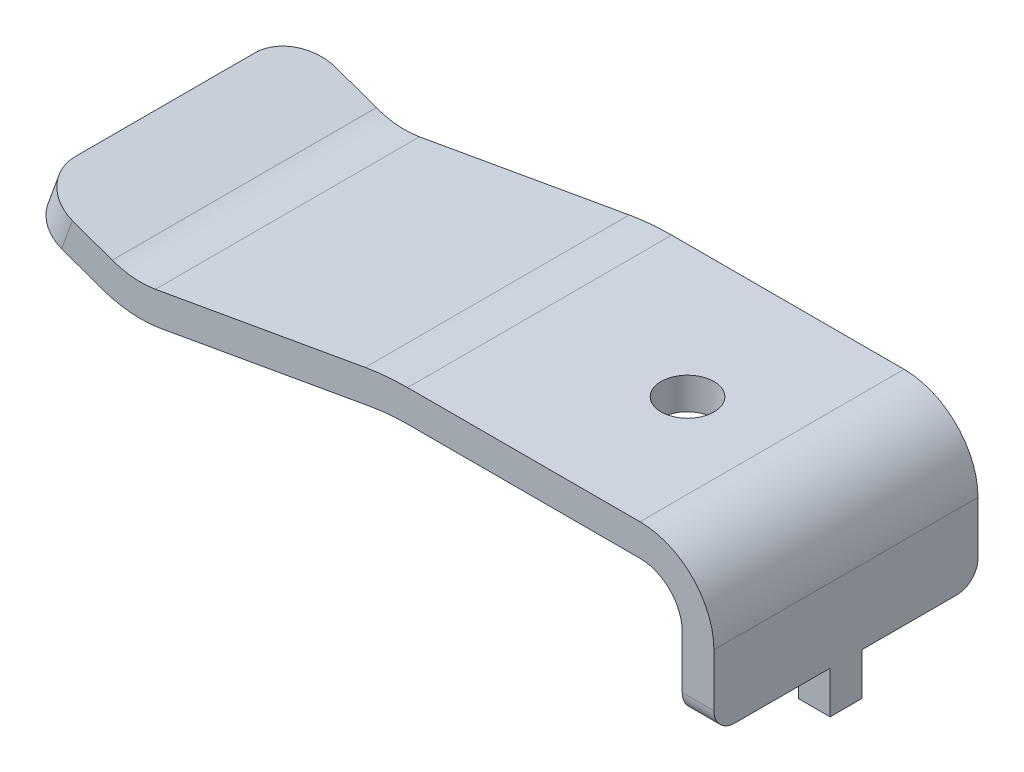
ISO-10303-21;
HEADER;
FILE_DESCRIPTION(('STEP AP214'),'2;1');
FILE_NAME('part.step','',(''),(''),'','','');
FILE_SCHEMA(('AUTOMOTIVE_DESIGN { 1 0 10303 214 1 1 1 1 }'));
ENDSEC;
DATA;
#1=APPLICATION_CONTEXT('core data for automotive mechanical design processes');
#2=APPLICATION_PROTOCOL_DEFINITION('international standard','automotive_design',2000,#1);
#3=PRODUCT_CONTEXT('',#1,'mechanical');
#4=PRODUCT('Part','Part','',(#3));
#5=PRODUCT_RELATED_PRODUCT_CATEGORY('part','',(#4));
#6=PRODUCT_DEFINITION_FORMATION('','',#4);
#7=PRODUCT_DEFINITION_CONTEXT('part definition',#1,'design');
#8=PRODUCT_DEFINITION('design','',#6,#7);
#9=PRODUCT_DEFINITION_SHAPE('','',#8);
#10=(LENGTH_UNIT() NAMED_UNIT(*) SI_UNIT(.MILLI.,.METRE.));
#11=(NAMED_UNIT(*) PLANE_ANGLE_UNIT() SI_UNIT($,.RADIAN.));
#12=(NAMED_UNIT(*) SI_UNIT($,.STERADIAN.) SOLID_ANGLE_UNIT());
#13=UNCERTAINTY_MEASURE_WITH_UNIT(LENGTH_MEASURE(1.E-05),#10,'distance_accuracy_value','');
#14=(GEOMETRIC_REPRESENTATION_CONTEXT(3) GLOBAL_UNCERTAINTY_ASSIGNED_CONTEXT((#13)) GLOBAL_UNIT_ASSIGNED_CONTEXT((#10,
#11,#12)) REPRESENTATION_CONTEXT('',''));
#15=CARTESIAN_POINT('',(0.,0.,0.));
#16=DIRECTION('',(0.,0.,1.));
#17=DIRECTION('',(1.,0.,0.));
#18=AXIS2_PLACEMENT_3D('',#15,#16,#17);
#19=CARTESIAN_POINT('',(-27.4903781497399,5.8216082742102,6.25));
#20=DIRECTION('',(-0.341026693224571,-0.94005361257128,0.));
#21=DIRECTION('',(0.94005361257128,-0.341026693224571,0.));
#22=AXIS2_PLACEMENT_3D('',#19,#20,#21);
#23=PLANE('',#22);
#24=DIRECTION('',(-0.94005361257128,0.341026693224571,0.));
#25=VECTOR('',#24,1.);
#26=CARTESIAN_POINT('',(-27.4955360364037,5.8234794196528,-6.25));
#27=LINE('',#26,#25);
#28=CARTESIAN_POINT('',(-27.4955360364037,5.8234794196528,-6.25));
#29=VERTEX_POINT('',#28);
#30=CARTESIAN_POINT('',(-29.3717153640693,6.50410786834311,-6.25));
#31=VERTEX_POINT('',#30);
#32=EDGE_CURVE('E160',#29,#31,#27,.T.);
#33=ORIENTED_EDGE('',*,*,#32,.F.);
#34=DIRECTION('',(0.,0.,-1.));
#35=VECTOR('',#34,1.);
#36=CARTESIAN_POINT('',(-27.4955360364037,5.8234794196528,6.25));
#37=LINE('',#36,#35);
#38=CARTESIAN_POINT('',(-27.4955360364037,5.8234794196528,6.25));
#39=VERTEX_POINT('',#38);
#40=EDGE_CURVE('E272',#39,#29,#37,.T.);
#41=ORIENTED_EDGE('',*,*,#40,.F.);
#42=DIRECTION('',(0.94005361257128,-0.341026693224571,0.));
#43=VECTOR('',#42,1.);
#44=CARTESIAN_POINT('',(-29.3717153640693,6.50410786834311,6.25));
#45=LINE('',#44,#43);
#46=CARTESIAN_POINT('',(-29.3717153640693,6.50410786834311,6.25));
#47=VERTEX_POINT('',#46);
#48=EDGE_CURVE('E184',#47,#39,#45,.T.);
#49=ORIENTED_EDGE('',*,*,#48,.F.);
#50=CARTESIAN_POINT('',(-29.3717153640693,6.50410786834311,4.25));
#51=DIRECTION('',(0.341026693224572,0.94005361257128,0.));
#52=DIRECTION('',(-0.94005361257128,0.341026693224572,0.));
#53=AXIS2_PLACEMENT_3D('',#50,#51,#52);
#54=CIRCLE('',#53,2.);
#55=CARTESIAN_POINT('',(-31.2518225892119,7.18616125479225,4.25));
#56=VERTEX_POINT('',#55);
#57=EDGE_CURVE('E186',#56,#47,#54,.T.);
#58=ORIENTED_EDGE('',*,*,#57,.F.);
#59=DIRECTION('',(0.,0.,1.));
#60=VECTOR('',#59,1.);
#61=CARTESIAN_POINT('',(-31.2518225892119,7.18616125479225,6.25));
#62=LINE('',#61,#60);
#63=CARTESIAN_POINT('',(-31.2518225892119,7.18616125479225,-4.25));
#64=VERTEX_POINT('',#63);
#65=EDGE_CURVE('E177',#64,#56,#62,.T.);
#66=ORIENTED_EDGE('',*,*,#65,.F.);
#67=CARTESIAN_POINT('',(-29.3717153640693,6.50410786834311,-4.25));
#68=DIRECTION('',(0.341026693224572,0.94005361257128,0.));
#69=DIRECTION('',(-0.94005361257128,0.341026693224572,0.));
#70=AXIS2_PLACEMENT_3D('',#67,#68,#69);
#71=CIRCLE('',#70,2.);
#72=EDGE_CURVE('E20',#31,#64,#71,.T.);
#73=ORIENTED_EDGE('',*,*,#72,.F.);
#74=EDGE_LOOP('',(#33,#41,#49,#58,#66,#73));
#75=FACE_BOUND('',#74,.T.);
#76=ADVANCED_FACE('F17',(#75),#23,.T.);
#77=CARTESIAN_POINT('',(-28.6089750620032,8.60663177822004,-4.25));
#78=DIRECTION('',(0.341026693224572,0.94005361257128,0.));
#79=DIRECTION('',(-0.94005361257128,0.341026693224572,0.));
#80=AXIS2_PLACEMENT_3D('',#77,#78,#79);
#81=CYLINDRICAL_SURFACE('',#80,2.);
#82=CARTESIAN_POINT('',(-28.8601753242325,7.91418828720003,-4.25));
#83=DIRECTION('',(0.341026693224572,0.94005361257128,0.));
#84=DIRECTION('',(-0.94005361257128,0.341026693224572,0.));
#85=AXIS2_PLACEMENT_3D('',#82,#83,#84);
#86=CIRCLE('',#85,2.);
#87=CARTESIAN_POINT('',(-30.740282549375,8.59624167364917,-4.25));
#88=VERTEX_POINT('',#87);
#89=CARTESIAN_POINT('',(-28.8601753242325,7.91418828720003,-6.25));
#90=VERTEX_POINT('',#89);
#91=EDGE_CURVE('E183',#88,#90,#86,.F.);
#92=ORIENTED_EDGE('',*,*,#91,.T.);
#93=DIRECTION('',(0.341026693224571,0.94005361257128,0.));
#94=VECTOR('',#93,1.);
#95=CARTESIAN_POINT('',(-29.3717153640693,6.50410786834311,-6.25));
#96=LINE('',#95,#94);
#97=EDGE_CURVE('E165',#31,#90,#96,.T.);
#98=ORIENTED_EDGE('',*,*,#97,.F.);
#99=ORIENTED_EDGE('',*,*,#72,.T.);
#100=DIRECTION('',(-0.341026693224572,-0.94005361257128,0.));
#101=VECTOR('',#100,1.);
#102=CARTESIAN_POINT('',(-31.2518225892119,7.18616125479225,-4.25));
#103=LINE('',#102,#101);
#104=EDGE_CURVE('E304',#88,#64,#103,.T.);
#105=ORIENTED_EDGE('',*,*,#104,.F.);
#106=EDGE_LOOP('',(#92,#98,#99,#105));
#107=FACE_BOUND('',#106,.T.);
#108=ADVANCED_FACE('F182',(#107),#81,.T.);
#109=CARTESIAN_POINT('',(-29.3717153640693,6.50410786834311,4.25));
#110=DIRECTION('',(0.341026693224572,0.94005361257128,0.));
#111=DIRECTION('',(-0.94005361257128,0.341026693224572,0.));
#112=AXIS2_PLACEMENT_3D('',#109,#110,#111);
#113=CYLINDRICAL_SURFACE('',#112,2.);
#114=CARTESIAN_POINT('',(-28.8601753242325,7.91418828720003,4.25));
#115=DIRECTION('',(0.341026693224572,0.94005361257128,0.));
#116=DIRECTION('',(-0.94005361257128,0.341026693224572,0.));
#117=AXIS2_PLACEMENT_3D('',#114,#115,#116);
#118=CIRCLE('',#117,2.);
#119=CARTESIAN_POINT('',(-28.8601753242325,7.91418828720003,6.25));
#120=VERTEX_POINT('',#119);
#121=CARTESIAN_POINT('',(-30.740282549375,8.59624167364917,4.25));
#122=VERTEX_POINT('',#121);
#123=EDGE_CURVE('E264',#120,#122,#118,.F.);
#124=ORIENTED_EDGE('',*,*,#123,.T.);
#125=DIRECTION('',(-0.341026693224572,-0.94005361257128,0.));
#126=VECTOR('',#125,1.);
#127=CARTESIAN_POINT('',(-31.2518225892119,7.18616125479225,4.25));
#128=LINE('',#127,#126);
#129=EDGE_CURVE('E192',#56,#122,#128,.F.);
#130=ORIENTED_EDGE('',*,*,#129,.F.);
#131=ORIENTED_EDGE('',*,*,#57,.T.);
#132=DIRECTION('',(0.341026693224572,0.94005361257128,0.));
#133=VECTOR('',#132,1.);
#134=CARTESIAN_POINT('',(-29.3717153640693,6.50410786834311,6.25));
#135=LINE('',#134,#133);
#136=EDGE_CURVE('E189',#47,#120,#135,.T.);
#137=ORIENTED_EDGE('',*,*,#136,.T.);
#138=EDGE_LOOP('',(#124,#130,#131,#137));
#139=FACE_BOUND('',#138,.T.);
#140=ADVANCED_FACE('F278',(#139),#113,.T.);
#141=CARTESIAN_POINT('',(-31.2518225892119,7.18616125479225,6.25));
#142=DIRECTION('',(-0.94005361257128,0.341026693224572,0.));
#143=DIRECTION('',(-0.341026693224572,-0.94005361257128,0.));
#144=AXIS2_PLACEMENT_3D('',#141,#142,#143);
#145=PLANE('',#144);
#146=DIRECTION('',(0.,0.,1.));
#147=VECTOR('',#146,1.);
#148=CARTESIAN_POINT('',(-30.740282549375,8.59624167364917,6.25));
#149=LINE('',#148,#147);
#150=EDGE_CURVE('E263',#122,#88,#149,.F.);
#151=ORIENTED_EDGE('',*,*,#150,.T.);
#152=ORIENTED_EDGE('',*,*,#104,.T.);
#153=ORIENTED_EDGE('',*,*,#65,.T.);
#154=ORIENTED_EDGE('',*,*,#129,.T.);
#155=EDGE_LOOP('',(#151,#152,#153,#154));
#156=FACE_BOUND('',#155,.T.);
#157=ADVANCED_FACE('F306',(#156),#145,.T.);
#158=CARTESIAN_POINT('',(-26.7327957343376,7.92600332952972,6.25));
#159=DIRECTION('',(0.,0.,-1.));
#160=DIRECTION('',(-1.,0.,0.));
#161=AXIS2_PLACEMENT_3D('',#158,#159,#160);
#162=CYLINDRICAL_SURFACE('',#161,2.2366);
#163=CARTESIAN_POINT('',(-26.7327957343376,7.92600332952972,6.25));
#164=DIRECTION('',(0.,0.,1.));
#165=DIRECTION('',(1.,0.,0.));
#166=AXIS2_PLACEMENT_3D('',#163,#164,#165);
#167=CIRCLE('',#166,2.2366);
#168=CARTESIAN_POINT('',(-27.4836700716117,5.81921257351642,6.25));
#169=VERTEX_POINT('',#168);
#170=EDGE_CURVE('E271',#39,#169,#167,.T.);
#171=ORIENTED_EDGE('',*,*,#170,.F.);
#172=ORIENTED_EDGE('',*,*,#40,.T.);
#173=CARTESIAN_POINT('',(-26.7327957343376,7.92600332952972,-6.25));
#174=DIRECTION('',(0.,0.,-1.));
#175=DIRECTION('',(-1.,0.,0.));
#176=AXIS2_PLACEMENT_3D('',#173,#174,#175);
#177=CIRCLE('',#176,2.2366);
#178=CARTESIAN_POINT('',(-27.4836700716117,5.81921257351642,-6.25));
#179=VERTEX_POINT('',#178);
#180=EDGE_CURVE('E169',#179,#29,#177,.T.);
#181=ORIENTED_EDGE('',*,*,#180,.F.);
#182=DIRECTION('',(0.,0.,-1.));
#183=VECTOR('',#182,1.);
#184=CARTESIAN_POINT('',(-27.4836700716117,5.81921257351642,6.25));
#185=LINE('',#184,#183);
#186=EDGE_CURVE('E261',#169,#179,#185,.T.);
#187=ORIENTED_EDGE('',*,*,#186,.F.);
#188=EDGE_LOOP('',(#171,#172,#181,#187));
#189=FACE_BOUND('',#188,.T.);
#190=ADVANCED_FACE('F312',(#189),#162,.T.);
#191=CARTESIAN_POINT('',(-26.9788381099031,7.23168869306712,6.25));
#192=DIRECTION('',(-0.341026693224571,-0.94005361257128,0.));
#193=DIRECTION('',(0.94005361257128,-0.341026693224571,0.));
#194=AXIS2_PLACEMENT_3D('',#191,#192,#193);
#195=PLANE('',#194);
#196=ORIENTED_EDGE('',*,*,#123,.F.);
#197=DIRECTION('',(0.94005361257128,-0.341026693224571,0.));
#198=VECTOR('',#197,1.);
#199=CARTESIAN_POINT('',(-26.9788381099031,7.23168869306712,6.25));
#200=LINE('',#199,#198);
#201=CARTESIAN_POINT('',(-26.9839959965668,7.23355983850972,6.25));
#202=VERTEX_POINT('',#201);
#203=EDGE_CURVE('E267',#202,#120,#200,.F.);
#204=ORIENTED_EDGE('',*,*,#203,.F.);
#205=DIRECTION('',(0.,0.,-1.));
#206=VECTOR('',#205,1.);
#207=CARTESIAN_POINT('',(-26.9839959965668,7.23355983850972,6.25));
#208=LINE('',#207,#206);
#209=CARTESIAN_POINT('',(-26.9839959965668,7.23355983850972,-6.25));
#210=VERTEX_POINT('',#209);
#211=EDGE_CURVE('E260',#202,#210,#208,.T.);
#212=ORIENTED_EDGE('',*,*,#211,.T.);
#213=DIRECTION('',(0.94005361257128,-0.341026693224571,0.));
#214=VECTOR('',#213,1.);
#215=CARTESIAN_POINT('',(-26.9788381099031,7.23168869306712,-6.25000000000001));
#216=LINE('',#215,#214);
#217=EDGE_CURVE('E269',#90,#210,#216,.T.);
#218=ORIENTED_EDGE('',*,*,#217,.F.);
#219=ORIENTED_EDGE('',*,*,#91,.F.);
#220=ORIENTED_EDGE('',*,*,#150,.F.);
#221=EDGE_LOOP('',(#196,#204,#212,#218,#219,#220));
#222=FACE_BOUND('',#221,.T.);
#223=ADVANCED_FACE('F284',(#222),#195,.F.);
#224=CARTESIAN_POINT('',(-25.6372027305549,11.,6.25));
#225=DIRECTION('',(0.,0.,-1.));
#226=DIRECTION('',(-1.,0.,0.));
#227=AXIS2_PLACEMENT_3D('',#224,#225,#226);
#228=CYLINDRICAL_SURFACE('',#227,5.5);
#229=CARTESIAN_POINT('',(-25.6372027305549,11.,6.25));
#230=DIRECTION('',(0.,0.,-1.));
#231=DIRECTION('',(-1.,0.,0.));
#232=AXIS2_PLACEMENT_3D('',#229,#230,#231);
#233=CIRCLE('',#232,5.5);
#234=CARTESIAN_POINT('',(-24.6764130843398,5.58456989189907,6.25));
#235=VERTEX_POINT('',#234);
#236=EDGE_CURVE('E258',#169,#235,#233,.F.);
#237=ORIENTED_EDGE('',*,*,#236,.F.);
#238=ORIENTED_EDGE('',*,*,#186,.T.);
#239=CARTESIAN_POINT('',(-25.6372027305549,11.,-6.25));
#240=DIRECTION('',(0.,0.,-1.));
#241=DIRECTION('',(-1.,0.,0.));
#242=AXIS2_PLACEMENT_3D('',#239,#240,#241);
#243=CIRCLE('',#242,5.5);
#244=CARTESIAN_POINT('',(-24.6764130843398,5.58456989189908,-6.25));
#245=VERTEX_POINT('',#244);
#246=EDGE_CURVE('E254',#245,#179,#243,.T.);
#247=ORIENTED_EDGE('',*,*,#246,.F.);
#248=DIRECTION('',(0.,0.,1.));
#249=VECTOR('',#248,1.);
#250=CARTESIAN_POINT('',(-24.6764130843398,5.58456989189908,6.25));
#251=LINE('',#250,#249);
#252=EDGE_CURVE('E256',#235,#245,#251,.F.);
#253=ORIENTED_EDGE('',*,*,#252,.F.);
#254=EDGE_LOOP('',(#237,#238,#247,#253));
#255=FACE_BOUND('',#254,.T.);
#256=ADVANCED_FACE('F316',(#255),#228,.T.);
#257=CARTESIAN_POINT('',(-26.7327957343376,7.92600332952972,6.25));
#258=DIRECTION('',(0.,0.,-1.));
#259=DIRECTION('',(-1.,0.,0.));
#260=AXIS2_PLACEMENT_3D('',#257,#258,#259);
#261=CYLINDRICAL_SURFACE('',#260,0.7366);
#262=ORIENTED_EDGE('',*,*,#211,.F.);
#263=DIRECTION('',(-0.941011220335044,0.338375358446136,0.));
#264=VECTOR('',#263,1.);
#265=CARTESIAN_POINT('',(-26.9800880695053,7.23215459892103,6.25));
#266=LINE('',#265,#264);
#267=CARTESIAN_POINT('',(-26.9800880695051,7.23215459892094,6.25));
#268=VERTEX_POINT('',#267);
#269=EDGE_CURVE('E270',#268,#202,#266,.T.);
#270=ORIENTED_EDGE('',*,*,#269,.F.);
#271=DIRECTION('',(0.,0.,-1.));
#272=VECTOR('',#271,1.);
#273=CARTESIAN_POINT('',(-26.9800880695053,7.23215459892103,6.25));
#274=LINE('',#273,#272);
#275=CARTESIAN_POINT('',(-26.9800880695053,7.23215459892103,-6.25));
#276=VERTEX_POINT('',#275);
#277=EDGE_CURVE('E241',#268,#276,#274,.T.);
#278=ORIENTED_EDGE('',*,*,#277,.T.);
#279=CARTESIAN_POINT('',(-26.7327957343376,7.92600332952972,-6.25));
#280=DIRECTION('',(0.,0.,-1.));
#281=DIRECTION('',(-1.,0.,0.));
#282=AXIS2_PLACEMENT_3D('',#279,#280,#281);
#283=CIRCLE('',#282,0.7366);
#284=EDGE_CURVE('E257',#210,#276,#283,.F.);
#285=ORIENTED_EDGE('',*,*,#284,.F.);
#286=EDGE_LOOP('',(#262,#270,#278,#285));
#287=FACE_BOUND('',#286,.T.);
#288=ADVANCED_FACE('F517',(#287),#261,.F.);
#289=CARTESIAN_POINT('',(0.,0.,6.25));
#290=DIRECTION('',(-1.,0.,0.));
#291=DIRECTION('',(0.,0.,1.));
#292=AXIS2_PLACEMENT_3D('',#289,#290,#291);
#293=PLANE('',#292);
#294=DIRECTION('',(0.,1.,0.));
#295=VECTOR('',#294,1.);
#296=CARTESIAN_POINT('',(0.,7.92600332952972,6.25));
#297=LINE('',#296,#295);
#298=CARTESIAN_POINT('',(0.,3.,6.25));
#299=VERTEX_POINT('',#298);
#300=CARTESIAN_POINT('',(0.,5.49999999999998,6.25));
#301=VERTEX_POINT('',#300);
#302=EDGE_CURVE('E365',#299,#301,#297,.T.);
#303=ORIENTED_EDGE('',*,*,#302,.T.);
#304=DIRECTION('',(0.,0.,-1.));
#305=VECTOR('',#304,1.);
#306=CARTESIAN_POINT('',(0.,5.49999999999998,6.25));
#307=LINE('',#306,#305);
#308=CARTESIAN_POINT('',(0.,5.49999999999998,-6.25));
#309=VERTEX_POINT('',#308);
#310=EDGE_CURVE('E366',#301,#309,#307,.T.);
#311=ORIENTED_EDGE('',*,*,#310,.T.);
#312=DIRECTION('',(0.,1.,0.));
#313=VECTOR('',#312,1.);
#314=CARTESIAN_POINT('',(0.,9.00000000000001,-6.25));
#315=LINE('',#314,#313);
#316=CARTESIAN_POINT('',(0.,3.,-6.25));
#317=VERTEX_POINT('',#316);
#318=EDGE_CURVE('E249',#317,#309,#315,.T.);
#319=ORIENTED_EDGE('',*,*,#318,.F.);
#320=CARTESIAN_POINT('',(0.,3.,-5.25));
#321=DIRECTION('',(1.,0.,0.));
#322=DIRECTION('',(0.,0.,-1.));
#323=AXIS2_PLACEMENT_3D('',#320,#321,#322);
#324=CIRCLE('',#323,1.);
#325=CARTESIAN_POINT('',(0.,2.,-5.25));
#326=VERTEX_POINT('',#325);
#327=EDGE_CURVE('E246',#326,#317,#324,.T.);
#328=ORIENTED_EDGE('',*,*,#327,.F.);
#329=DIRECTION('',(0.,0.,1.));
#330=VECTOR('',#329,1.);
#331=CARTESIAN_POINT('',(0.,2.,-6.25));
#332=LINE('',#331,#330);
#333=CARTESIAN_POINT('',(0.,2.,-0.750000000000001));
#334=VERTEX_POINT('',#333);
#335=EDGE_CURVE('E326',#326,#334,#332,.T.);
#336=ORIENTED_EDGE('',*,*,#335,.T.);
#337=DIRECTION('',(0.,1.,0.));
#338=VECTOR('',#337,1.);
#339=CARTESIAN_POINT('',(0.,0.,-0.750000000000001));
#340=LINE('',#339,#338);
#341=CARTESIAN_POINT('',(0.,0.,-0.750000000000001));
#342=VERTEX_POINT('',#341);
#343=EDGE_CURVE('E321',#334,#342,#340,.F.);
#344=ORIENTED_EDGE('',*,*,#343,.T.);
#345=DIRECTION('',(0.,0.,-1.));
#346=VECTOR('',#345,1.);
#347=CARTESIAN_POINT('',(0.,0.,6.25));
#348=LINE('',#347,#346);
#349=CARTESIAN_POINT('',(0.,0.,0.749999999999999));
#350=VERTEX_POINT('',#349);
#351=EDGE_CURVE('E339',#350,#342,#348,.T.);
#352=ORIENTED_EDGE('',*,*,#351,.F.);
#353=DIRECTION('',(0.,1.,0.));
#354=VECTOR('',#353,1.);
#355=CARTESIAN_POINT('',(0.,0.,0.749999999999999));
#356=LINE('',#355,#354);
#357=CARTESIAN_POINT('',(0.,2.,0.749999999999999));
#358=VERTEX_POINT('',#357);
#359=EDGE_CURVE('E347',#350,#358,#356,.T.);
#360=ORIENTED_EDGE('',*,*,#359,.T.);
#361=DIRECTION('',(0.,0.,1.));
#362=VECTOR('',#361,1.);
#363=CARTESIAN_POINT('',(0.,2.,6.25));
#364=LINE('',#363,#362);
#365=CARTESIAN_POINT('',(0.,2.,5.25));
#366=VERTEX_POINT('',#365);
#367=EDGE_CURVE('E253',#358,#366,#364,.T.);
#368=ORIENTED_EDGE('',*,*,#367,.T.);
#369=CARTESIAN_POINT('',(0.,3.,5.25));
#370=DIRECTION('',(1.,0.,0.));
#371=DIRECTION('',(0.,0.,-1.));
#372=AXIS2_PLACEMENT_3D('',#369,#370,#371);
#373=CIRCLE('',#372,1.);
#374=EDGE_CURVE('E250',#299,#366,#373,.T.);
#375=ORIENTED_EDGE('',*,*,#374,.F.);
#376=EDGE_LOOP('',(#303,#311,#319,#328,#336,#344,#352,#360,#368,#375));
#377=FACE_BOUND('',#376,.T.);
#378=ADVANCED_FACE('F473',(#377),#293,.T.);
#379=CARTESIAN_POINT('',(-24.6764130843398,5.58456989189908,6.25));
#380=DIRECTION('',(0.174689026584553,-0.98462365601835,0.));
#381=DIRECTION('',(0.98462365601835,0.174689026584553,0.));
#382=AXIS2_PLACEMENT_3D('',#379,#380,#381);
#383=PLANE('',#382);
#384=DIRECTION('',(0.98462365601835,0.174689026584553,0.));
#385=VECTOR('',#384,1.);
#386=CARTESIAN_POINT('',(-24.6764130843398,5.58456989189908,6.25));
#387=LINE('',#386,#385);
#388=CARTESIAN_POINT('',(-14.7468902658455,7.3462365601835,6.25));
#389=VERTEX_POINT('',#388);
#390=EDGE_CURVE('E245',#235,#389,#387,.T.);
#391=ORIENTED_EDGE('',*,*,#390,.F.);
#392=ORIENTED_EDGE('',*,*,#252,.T.);
#393=DIRECTION('',(-0.98462365601835,-0.174689026584553,0.));
#394=VECTOR('',#393,1.);
#395=CARTESIAN_POINT('',(-14.7468902658455,7.3462365601835,-6.25));
#396=LINE('',#395,#394);
#397=CARTESIAN_POINT('',(-14.7468902658455,7.3462365601835,-6.25));
#398=VERTEX_POINT('',#397);
#399=EDGE_CURVE('E240',#398,#245,#396,.T.);
#400=ORIENTED_EDGE('',*,*,#399,.F.);
#401=DIRECTION('',(0.,0.,-1.));
#402=VECTOR('',#401,1.);
#403=CARTESIAN_POINT('',(-14.7468902658455,7.3462365601835,6.25));
#404=LINE('',#403,#402);
#405=EDGE_CURVE('E237',#398,#389,#404,.F.);
#406=ORIENTED_EDGE('',*,*,#405,.T.);
#407=EDGE_LOOP('',(#391,#392,#400,#406));
#408=FACE_BOUND('',#407,.T.);
#409=ADVANCED_FACE('F324',(#408),#383,.T.);
#410=CARTESIAN_POINT('',(5.,0.,-0.750000000000001));
#411=DIRECTION('',(0.,0.,1.));
#412=DIRECTION('',(1.,0.,0.));
#413=AXIS2_PLACEMENT_3D('',#410,#411,#412);
#414=PLANE('',#413);
#415=ORIENTED_EDGE('',*,*,#343,.F.);
#416=DIRECTION('',(1.,0.,0.));
#417=VECTOR('',#416,1.);
#418=CARTESIAN_POINT('',(5.,2.,-0.750000000000001));
#419=LINE('',#418,#417);
#420=CARTESIAN_POINT('',(1.5,2.,-0.750000000000001));
#421=VERTEX_POINT('',#420);
#422=EDGE_CURVE('E398',#334,#421,#419,.T.);
#423=ORIENTED_EDGE('',*,*,#422,.T.);
#424=DIRECTION('',(0.,1.,0.));
#425=VECTOR('',#424,1.);
#426=CARTESIAN_POINT('',(1.5,0.,-0.750000000000001));
#427=LINE('',#426,#425);
#428=CARTESIAN_POINT('',(1.5,0.,-0.750000000000001));
#429=VERTEX_POINT('',#428);
#430=EDGE_CURVE('E234',#421,#429,#427,.F.);
#431=ORIENTED_EDGE('',*,*,#430,.T.);
#432=DIRECTION('',(1.,0.,0.));
#433=VECTOR('',#432,1.);
#434=CARTESIAN_POINT('',(1.5,0.,-0.750000000000001));
#435=LINE('',#434,#433);
#436=EDGE_CURVE('E355',#342,#429,#435,.T.);
#437=ORIENTED_EDGE('',*,*,#436,.F.);
#438=EDGE_LOOP('',(#415,#423,#431,#437));
#439=FACE_BOUND('',#438,.T.);
#440=ADVANCED_FACE('F677',(#439),#414,.F.);
#441=CARTESIAN_POINT('',(1.5,0.,6.25));
#442=DIRECTION('',(0.,-1.,0.));
#443=DIRECTION('',(0.,0.,-1.));
#444=AXIS2_PLACEMENT_3D('',#441,#442,#443);
#445=PLANE('',#444);
#446=ORIENTED_EDGE('',*,*,#436,.T.);
#447=DIRECTION('',(0.,0.,1.));
#448=VECTOR('',#447,1.);
#449=CARTESIAN_POINT('',(1.5,0.,6.25));
#450=LINE('',#449,#448);
#451=CARTESIAN_POINT('',(1.5,0.,0.749999999999999));
#452=VERTEX_POINT('',#451);
#453=EDGE_CURVE('E378',#429,#452,#450,.T.);
#454=ORIENTED_EDGE('',*,*,#453,.T.);
#455=DIRECTION('',(-1.,0.,0.));
#456=VECTOR('',#455,1.);
#457=CARTESIAN_POINT('',(5.,0.,0.749999999999999));
#458=LINE('',#457,#456);
#459=EDGE_CURVE('E350',#452,#350,#458,.T.);
#460=ORIENTED_EDGE('',*,*,#459,.T.);
#461=ORIENTED_EDGE('',*,*,#351,.T.);
#462=EDGE_LOOP('',(#446,#454,#460,#461));
#463=FACE_BOUND('',#462,.T.);
#464=ADVANCED_FACE('F669',(#463),#445,.T.);
#465=CARTESIAN_POINT('',(5.,0.,0.749999999999999));
#466=DIRECTION('',(0.,0.,-1.));
#467=DIRECTION('',(-1.,0.,0.));
#468=AXIS2_PLACEMENT_3D('',#465,#466,#467);
#469=PLANE('',#468);
#470=ORIENTED_EDGE('',*,*,#359,.F.);
#471=ORIENTED_EDGE('',*,*,#459,.F.);
#472=DIRECTION('',(0.,1.,0.));
#473=VECTOR('',#472,1.);
#474=CARTESIAN_POINT('',(1.5,0.,0.749999999999999));
#475=LINE('',#474,#473);
#476=CARTESIAN_POINT('',(1.5,2.,0.749999999999999));
#477=VERTEX_POINT('',#476);
#478=EDGE_CURVE('E381',#452,#477,#475,.T.);
#479=ORIENTED_EDGE('',*,*,#478,.T.);
#480=DIRECTION('',(1.,0.,0.));
#481=VECTOR('',#480,1.);
#482=CARTESIAN_POINT('',(5.,2.,0.749999999999999));
#483=LINE('',#482,#481);
#484=EDGE_CURVE('E344',#477,#358,#483,.F.);
#485=ORIENTED_EDGE('',*,*,#484,.T.);
#486=EDGE_LOOP('',(#470,#471,#479,#485));
#487=FACE_BOUND('',#486,.T.);
#488=ADVANCED_FACE('F501',(#487),#469,.F.);
#489=CARTESIAN_POINT('',(5.,2.,6.25));
#490=DIRECTION('',(0.,1.,0.));
#491=DIRECTION('',(0.,0.,1.));
#492=AXIS2_PLACEMENT_3D('',#489,#490,#491);
#493=PLANE('',#492);
#494=DIRECTION('',(1.,0.,0.));
#495=VECTOR('',#494,1.);
#496=CARTESIAN_POINT('',(-26.7327957343376,2.,5.25));
#497=LINE('',#496,#495);
#498=CARTESIAN_POINT('',(1.5,2.,5.25));
#499=VERTEX_POINT('',#498);
#500=EDGE_CURVE('E252',#366,#499,#497,.T.);
#501=ORIENTED_EDGE('',*,*,#500,.F.);
#502=ORIENTED_EDGE('',*,*,#367,.F.);
#503=ORIENTED_EDGE('',*,*,#484,.F.);
#504=DIRECTION('',(0.,0.,1.));
#505=VECTOR('',#504,1.);
#506=CARTESIAN_POINT('',(1.5,2.,6.25));
#507=LINE('',#506,#505);
#508=EDGE_CURVE('E230',#477,#499,#507,.T.);
#509=ORIENTED_EDGE('',*,*,#508,.T.);
#510=EDGE_LOOP('',(#501,#502,#503,#509));
#511=FACE_BOUND('',#510,.T.);
#512=ADVANCED_FACE('F496',(#511),#493,.F.);
#513=CARTESIAN_POINT('',(-26.7327957343376,3.,5.25));
#514=DIRECTION('',(1.,0.,0.));
#515=DIRECTION('',(0.,0.,-1.));
#516=AXIS2_PLACEMENT_3D('',#513,#514,#515);
#517=CYLINDRICAL_SURFACE('',#516,1.);
#518=CARTESIAN_POINT('',(1.5,3.,5.25));
#519=DIRECTION('',(1.,0.,0.));
#520=DIRECTION('',(0.,0.,-1.));
#521=AXIS2_PLACEMENT_3D('',#518,#519,#520);
#522=CIRCLE('',#521,1.);
#523=CARTESIAN_POINT('',(1.5,3.,6.25));
#524=VERTEX_POINT('',#523);
#525=EDGE_CURVE('E226',#499,#524,#522,.F.);
#526=ORIENTED_EDGE('',*,*,#525,.T.);
#527=DIRECTION('',(-1.,0.,0.));
#528=VECTOR('',#527,1.);
#529=CARTESIAN_POINT('',(-26.7327957343376,3.,6.25));
#530=LINE('',#529,#528);
#531=EDGE_CURVE('E371',#524,#299,#530,.T.);
#532=ORIENTED_EDGE('',*,*,#531,.T.);
#533=ORIENTED_EDGE('',*,*,#374,.T.);
#534=ORIENTED_EDGE('',*,*,#500,.T.);
#535=EDGE_LOOP('',(#526,#532,#533,#534));
#536=FACE_BOUND('',#535,.T.);
#537=ADVANCED_FACE('F490',(#536),#517,.T.);
#538=CARTESIAN_POINT('',(-2.00000000000003,3.,-5.25));
#539=DIRECTION('',(1.,0.,0.));
#540=DIRECTION('',(0.,0.,-1.));
#541=AXIS2_PLACEMENT_3D('',#538,#539,#540);
#542=CYLINDRICAL_SURFACE('',#541,1.);
#543=ORIENTED_EDGE('',*,*,#327,.T.);
#544=DIRECTION('',(1.,0.,0.));
#545=VECTOR('',#544,1.);
#546=CARTESIAN_POINT('',(-2.00000000000003,3.,-6.25));
#547=LINE('',#546,#545);
#548=CARTESIAN_POINT('',(1.5,3.,-6.25));
#549=VERTEX_POINT('',#548);
#550=EDGE_CURVE('E248',#317,#549,#547,.T.);
#551=ORIENTED_EDGE('',*,*,#550,.T.);
#552=CARTESIAN_POINT('',(1.5,3.,-5.25));
#553=DIRECTION('',(1.,0.,0.));
#554=DIRECTION('',(0.,0.,-1.));
#555=AXIS2_PLACEMENT_3D('',#552,#553,#554);
#556=CIRCLE('',#555,1.);
#557=CARTESIAN_POINT('',(1.5,2.,-5.25));
#558=VERTEX_POINT('',#557);
#559=EDGE_CURVE('E222',#549,#558,#556,.F.);
#560=ORIENTED_EDGE('',*,*,#559,.T.);
#561=DIRECTION('',(1.,0.,0.));
#562=VECTOR('',#561,1.);
#563=CARTESIAN_POINT('',(5.,2.,-5.25));
#564=LINE('',#563,#562);
#565=EDGE_CURVE('E329',#558,#326,#564,.F.);
#566=ORIENTED_EDGE('',*,*,#565,.T.);
#567=EDGE_LOOP('',(#543,#551,#560,#566));
#568=FACE_BOUND('',#567,.T.);
#569=ADVANCED_FACE('F469',(#568),#542,.T.);
#570=CARTESIAN_POINT('',(5.,2.,-6.25));
#571=DIRECTION('',(0.,1.,0.));
#572=DIRECTION('',(0.,0.,1.));
#573=AXIS2_PLACEMENT_3D('',#570,#571,#572);
#574=PLANE('',#573);
#575=ORIENTED_EDGE('',*,*,#565,.F.);
#576=DIRECTION('',(0.,0.,1.));
#577=VECTOR('',#576,1.);
#578=CARTESIAN_POINT('',(1.5,2.,6.25));
#579=LINE('',#578,#577);
#580=EDGE_CURVE('E221',#558,#421,#579,.T.);
#581=ORIENTED_EDGE('',*,*,#580,.T.);
#582=ORIENTED_EDGE('',*,*,#422,.F.);
#583=ORIENTED_EDGE('',*,*,#335,.F.);
#584=EDGE_LOOP('',(#575,#581,#582,#583));
#585=FACE_BOUND('',#584,.T.);
#586=ADVANCED_FACE('F632',(#585),#574,.F.);
#587=CARTESIAN_POINT('',(-25.6372027305549,11.,6.25));
#588=DIRECTION('',(0.,0.,-1.));
#589=DIRECTION('',(-1.,0.,0.));
#590=AXIS2_PLACEMENT_3D('',#587,#588,#589);
#591=CYLINDRICAL_SURFACE('',#590,4.);
#592=ORIENTED_EDGE('',*,*,#277,.F.);
#593=CARTESIAN_POINT('',(-25.6372027305549,11.,6.25));
#594=DIRECTION('',(0.,0.,-1.));
#595=DIRECTION('',(-1.,0.,0.));
#596=AXIS2_PLACEMENT_3D('',#593,#594,#595);
#597=CIRCLE('',#596,4.);
#598=CARTESIAN_POINT('',(-24.9384466242167,7.0615053759266,6.25));
#599=VERTEX_POINT('',#598);
#600=EDGE_CURVE('E242',#599,#268,#597,.T.);
#601=ORIENTED_EDGE('',*,*,#600,.F.);
#602=DIRECTION('',(0.,0.,1.));
#603=VECTOR('',#602,1.);
#604=CARTESIAN_POINT('',(-24.9384466242167,7.0615053759266,6.25));
#605=LINE('',#604,#603);
#606=CARTESIAN_POINT('',(-24.9384466242167,7.0615053759266,-6.25));
#607=VERTEX_POINT('',#606);
#608=EDGE_CURVE('E410',#599,#607,#605,.F.);
#609=ORIENTED_EDGE('',*,*,#608,.T.);
#610=CARTESIAN_POINT('',(-25.6372027305549,11.,-6.25));
#611=DIRECTION('',(0.,0.,-1.));
#612=DIRECTION('',(-1.,0.,0.));
#613=AXIS2_PLACEMENT_3D('',#610,#611,#612);
#614=CIRCLE('',#613,4.);
#615=EDGE_CURVE('E238',#276,#607,#614,.F.);
#616=ORIENTED_EDGE('',*,*,#615,.F.);
#617=EDGE_LOOP('',(#592,#601,#609,#616));
#618=FACE_BOUND('',#617,.T.);
#619=ADVANCED_FACE('F520',(#618),#591,.F.);
#620=CARTESIAN_POINT('',(-2.00000000000003,5.49999999999998,6.25));
#621=DIRECTION('',(0.,0.,-1.));
#622=DIRECTION('',(-1.,0.,0.));
#623=AXIS2_PLACEMENT_3D('',#620,#621,#622);
#624=CYLINDRICAL_SURFACE('',#623,2.00000000000003);
#625=ORIENTED_EDGE('',*,*,#310,.F.);
#626=CARTESIAN_POINT('',(-2.00000000000003,5.49999999999998,6.25));
#627=DIRECTION('',(0.,0.,-1.));
#628=DIRECTION('',(-1.,0.,0.));
#629=AXIS2_PLACEMENT_3D('',#626,#627,#628);
#630=CIRCLE('',#629,2.00000000000003);
#631=CARTESIAN_POINT('',(-2.00000000000003,7.50000000000001,6.25));
#632=VERTEX_POINT('',#631);
#633=EDGE_CURVE('E231',#632,#301,#630,.T.);
#634=ORIENTED_EDGE('',*,*,#633,.F.);
#635=DIRECTION('',(0.,0.,-1.));
#636=VECTOR('',#635,1.);
#637=CARTESIAN_POINT('',(-2.00000000000003,7.50000000000001,6.25));
#638=LINE('',#637,#636);
#639=CARTESIAN_POINT('',(-2.00000000000003,7.50000000000001,-6.25));
#640=VERTEX_POINT('',#639);
#641=EDGE_CURVE('E215',#640,#632,#638,.F.);
#642=ORIENTED_EDGE('',*,*,#641,.F.);
#643=CARTESIAN_POINT('',(-2.00000000000003,5.49999999999998,-6.25));
#644=DIRECTION('',(0.,0.,-1.));
#645=DIRECTION('',(-1.,0.,0.));
#646=AXIS2_PLACEMENT_3D('',#643,#644,#645);
#647=CIRCLE('',#646,2.00000000000003);
#648=EDGE_CURVE('E235',#309,#640,#647,.F.);
#649=ORIENTED_EDGE('',*,*,#648,.F.);
#650=EDGE_LOOP('',(#625,#634,#642,#649));
#651=FACE_BOUND('',#650,.T.);
#652=ADVANCED_FACE('F485',(#651),#624,.F.);
#653=CARTESIAN_POINT('',(-13.,-2.5,6.25));
#654=DIRECTION('',(0.,0.,-1.));
#655=DIRECTION('',(-1.,0.,0.));
#656=AXIS2_PLACEMENT_3D('',#653,#654,#655);
#657=CYLINDRICAL_SURFACE('',#656,10.);
#658=DIRECTION('',(0.,0.,-1.));
#659=VECTOR('',#658,1.);
#660=CARTESIAN_POINT('',(-13.,7.50000000000001,6.25));
#661=LINE('',#660,#659);
#662=CARTESIAN_POINT('',(-13.,7.5,6.25));
#663=VERTEX_POINT('',#662);
#664=CARTESIAN_POINT('',(-13.,7.5,-6.25));
#665=VERTEX_POINT('',#664);
#666=EDGE_CURVE('E212',#663,#665,#661,.T.);
#667=ORIENTED_EDGE('',*,*,#666,.F.);
#668=CARTESIAN_POINT('',(-13.,-2.5,6.25));
#669=DIRECTION('',(0.,0.,-1.));
#670=DIRECTION('',(-1.,0.,0.));
#671=AXIS2_PLACEMENT_3D('',#668,#669,#670);
#672=CIRCLE('',#671,10.);
#673=EDGE_CURVE('E213',#389,#663,#672,.T.);
#674=ORIENTED_EDGE('',*,*,#673,.F.);
#675=ORIENTED_EDGE('',*,*,#405,.F.);
#676=CARTESIAN_POINT('',(-13.,-2.5,-6.25));
#677=DIRECTION('',(0.,0.,-1.));
#678=DIRECTION('',(-1.,0.,0.));
#679=AXIS2_PLACEMENT_3D('',#676,#677,#678);
#680=CIRCLE('',#679,10.);
#681=EDGE_CURVE('E217',#665,#398,#680,.F.);
#682=ORIENTED_EDGE('',*,*,#681,.F.);
#683=EDGE_LOOP('',(#667,#674,#675,#682));
#684=FACE_BOUND('',#683,.T.);
#685=ADVANCED_FACE('F532',(#684),#657,.F.);
#686=CARTESIAN_POINT('',(1.5,0.,6.25));
#687=DIRECTION('',(-1.,0.,0.));
#688=DIRECTION('',(0.,0.,1.));
#689=AXIS2_PLACEMENT_3D('',#686,#687,#688);
#690=PLANE('',#689);
#691=ORIENTED_EDGE('',*,*,#559,.F.);
#692=DIRECTION('',(0.,1.,0.));
#693=VECTOR('',#692,1.);
#694=CARTESIAN_POINT('',(1.5,0.,-6.25));
#695=LINE('',#694,#693);
#696=CARTESIAN_POINT('',(1.5,5.49999999999998,-6.25));
#697=VERTEX_POINT('',#696);
#698=EDGE_CURVE('E225',#697,#549,#695,.F.);
#699=ORIENTED_EDGE('',*,*,#698,.F.);
#700=DIRECTION('',(0.,0.,-1.));
#701=VECTOR('',#700,1.);
#702=CARTESIAN_POINT('',(1.5,5.49999999999998,6.25));
#703=LINE('',#702,#701);
#704=CARTESIAN_POINT('',(1.5,5.49999999999998,6.25));
#705=VERTEX_POINT('',#704);
#706=EDGE_CURVE('E206',#705,#697,#703,.T.);
#707=ORIENTED_EDGE('',*,*,#706,.F.);
#708=DIRECTION('',(0.,1.,0.));
#709=VECTOR('',#708,1.);
#710=CARTESIAN_POINT('',(1.5,0.,6.25));
#711=LINE('',#710,#709);
#712=EDGE_CURVE('E229',#524,#705,#711,.T.);
#713=ORIENTED_EDGE('',*,*,#712,.F.);
#714=ORIENTED_EDGE('',*,*,#525,.F.);
#715=ORIENTED_EDGE('',*,*,#508,.F.);
#716=ORIENTED_EDGE('',*,*,#478,.F.);
#717=ORIENTED_EDGE('',*,*,#453,.F.);
#718=ORIENTED_EDGE('',*,*,#430,.F.);
#719=ORIENTED_EDGE('',*,*,#580,.F.);
#720=EDGE_LOOP('',(#691,#699,#707,#713,#714,#715,#716,#717,#718,#719));
#721=FACE_BOUND('',#720,.T.);
#722=ADVANCED_FACE('F464',(#721),#690,.F.);
#723=CARTESIAN_POINT('',(-24.9384466242167,7.0615053759266,6.25));
#724=DIRECTION('',(0.174689026584553,-0.98462365601835,0.));
#725=DIRECTION('',(0.98462365601835,0.174689026584553,0.));
#726=AXIS2_PLACEMENT_3D('',#723,#724,#725);
#727=PLANE('',#726);
#728=ORIENTED_EDGE('',*,*,#608,.F.);
#729=DIRECTION('',(0.98462365601835,0.174689026584553,0.));
#730=VECTOR('',#729,1.);
#731=CARTESIAN_POINT('',(-24.9384466242167,7.0615053759266,6.25));
#732=LINE('',#731,#730);
#733=CARTESIAN_POINT('',(-15.0089238057224,8.82317204421103,6.25));
#734=VERTEX_POINT('',#733);
#735=EDGE_CURVE('E220',#734,#599,#732,.F.);
#736=ORIENTED_EDGE('',*,*,#735,.F.);
#737=DIRECTION('',(0.,0.,-1.));
#738=VECTOR('',#737,1.);
#739=CARTESIAN_POINT('',(-15.0089238057224,8.82317204421102,6.25));
#740=LINE('',#739,#738);
#741=CARTESIAN_POINT('',(-15.0089238057224,8.82317204421103,-6.25));
#742=VERTEX_POINT('',#741);
#743=EDGE_CURVE('E201',#742,#734,#740,.F.);
#744=ORIENTED_EDGE('',*,*,#743,.F.);
#745=DIRECTION('',(0.98462365601835,0.174689026584553,0.));
#746=VECTOR('',#745,1.);
#747=CARTESIAN_POINT('',(-24.9384466242167,7.0615053759266,-6.25));
#748=LINE('',#747,#746);
#749=EDGE_CURVE('E216',#607,#742,#748,.T.);
#750=ORIENTED_EDGE('',*,*,#749,.F.);
#751=EDGE_LOOP('',(#728,#736,#744,#750));
#752=FACE_BOUND('',#751,.T.);
#753=ADVANCED_FACE('F522',(#752),#727,.F.);
#754=CARTESIAN_POINT('',(-13.,7.50000000000001,6.25));
#755=DIRECTION('',(0.,-1.,0.));
#756=DIRECTION('',(0.,0.,-1.));
#757=AXIS2_PLACEMENT_3D('',#754,#755,#756);
#758=PLANE('',#757);
#759=DIRECTION('',(1.,0.,0.));
#760=VECTOR('',#759,1.);
#761=CARTESIAN_POINT('',(1.5,7.50000000000001,6.25));
#762=LINE('',#761,#760);
#763=EDGE_CURVE('E203',#663,#632,#762,.T.);
#764=ORIENTED_EDGE('',*,*,#763,.F.);
#765=ORIENTED_EDGE('',*,*,#666,.T.);
#766=DIRECTION('',(-1.,0.,0.));
#767=VECTOR('',#766,1.);
#768=CARTESIAN_POINT('',(-15.0089238057224,7.50000000000001,-6.25));
#769=LINE('',#768,#767);
#770=EDGE_CURVE('E198',#640,#665,#769,.T.);
#771=ORIENTED_EDGE('',*,*,#770,.F.);
#772=ORIENTED_EDGE('',*,*,#641,.T.);
#773=EDGE_LOOP('',(#764,#765,#771,#772));
#774=FACE_BOUND('',#773,.T.);
#775=CARTESIAN_POINT('',(-6.,7.50000000000001,0.));
#776=DIRECTION('',(0.,-1.,0.));
#777=DIRECTION('',(0.,0.,-1.));
#778=AXIS2_PLACEMENT_3D('',#775,#776,#777);
#779=CIRCLE('',#778,1.25);
#780=CARTESIAN_POINT('',(-6.,7.50000000000001,-1.25));
#781=VERTEX_POINT('',#780);
#782=EDGE_CURVE('E209',#781,#781,#779,.F.);
#783=ORIENTED_EDGE('',*,*,#782,.T.);
#784=EDGE_LOOP('',(#783));
#785=FACE_BOUND('',#784,.T.);
#786=ADVANCED_FACE('F480',(#774,#785),#758,.T.);
#787=CARTESIAN_POINT('',(-6.,7.50000000000001,0.));
#788=DIRECTION('',(0.,-1.,0.));
#789=DIRECTION('',(0.,0.,-1.));
#790=AXIS2_PLACEMENT_3D('',#787,#788,#789);
#791=CYLINDRICAL_SURFACE('',#790,1.25);
#792=CARTESIAN_POINT('',(-6.,9.00000000000001,0.));
#793=DIRECTION('',(0.,-1.,0.));
#794=DIRECTION('',(0.,0.,-1.));
#795=AXIS2_PLACEMENT_3D('',#792,#793,#794);
#796=CIRCLE('',#795,1.25);
#797=CARTESIAN_POINT('',(-6.,9.00000000000001,-1.25));
#798=VERTEX_POINT('',#797);
#799=EDGE_CURVE('E194',#798,#798,#796,.F.);
#800=ORIENTED_EDGE('',*,*,#799,.T.);
#801=EDGE_LOOP('',(#800));
#802=FACE_BOUND('',#801,.T.);
#803=ORIENTED_EDGE('',*,*,#782,.F.);
#804=EDGE_LOOP('',(#803));
#805=FACE_BOUND('',#804,.T.);
#806=ADVANCED_FACE('F530',(#802,#805),#791,.F.);
#807=CARTESIAN_POINT('',(-2.00000000000003,5.49999999999998,6.25));
#808=DIRECTION('',(0.,0.,-1.));
#809=DIRECTION('',(-1.,0.,0.));
#810=AXIS2_PLACEMENT_3D('',#807,#808,#809);
#811=CYLINDRICAL_SURFACE('',#810,3.50000000000003);
#812=CARTESIAN_POINT('',(-2.00000000000003,5.49999999999998,6.25));
#813=DIRECTION('',(0.,0.,-1.));
#814=DIRECTION('',(-1.,0.,0.));
#815=AXIS2_PLACEMENT_3D('',#812,#813,#814);
#816=CIRCLE('',#815,3.50000000000003);
#817=CARTESIAN_POINT('',(-2.00000000000003,9.00000000000001,6.25));
#818=VERTEX_POINT('',#817);
#819=EDGE_CURVE('E204',#818,#705,#816,.T.);
#820=ORIENTED_EDGE('',*,*,#819,.T.);
#821=ORIENTED_EDGE('',*,*,#706,.T.);
#822=CARTESIAN_POINT('',(-2.00000000000003,5.49999999999998,-6.25));
#823=DIRECTION('',(0.,0.,-1.));
#824=DIRECTION('',(-1.,0.,0.));
#825=AXIS2_PLACEMENT_3D('',#822,#823,#824);
#826=CIRCLE('',#825,3.50000000000003);
#827=CARTESIAN_POINT('',(-2.00000000000003,9.00000000000001,-6.25));
#828=VERTEX_POINT('',#827);
#829=EDGE_CURVE('E207',#697,#828,#826,.F.);
#830=ORIENTED_EDGE('',*,*,#829,.T.);
#831=DIRECTION('',(0.,0.,-1.));
#832=VECTOR('',#831,1.);
#833=CARTESIAN_POINT('',(-2.00000000000003,9.00000000000001,6.25));
#834=LINE('',#833,#832);
#835=EDGE_CURVE('E197',#828,#818,#834,.F.);
#836=ORIENTED_EDGE('',*,*,#835,.T.);
#837=EDGE_LOOP('',(#820,#821,#830,#836));
#838=FACE_BOUND('',#837,.T.);
#839=ADVANCED_FACE('F458',(#838),#811,.T.);
#840=CARTESIAN_POINT('',(1.5,5.49999999999998,6.25));
#841=DIRECTION('',(0.,0.,1.));
#842=DIRECTION('',(1.,0.,0.));
#843=AXIS2_PLACEMENT_3D('',#840,#841,#842);
#844=PLANE('',#843);
#845=DIRECTION('',(1.,0.,0.));
#846=VECTOR('',#845,1.);
#847=CARTESIAN_POINT('',(-13.,9.00000000000001,6.25));
#848=LINE('',#847,#846);
#849=CARTESIAN_POINT('',(-13.,9.00000000000001,6.25));
#850=VERTEX_POINT('',#849);
#851=EDGE_CURVE('E419',#818,#850,#848,.F.);
#852=ORIENTED_EDGE('',*,*,#851,.T.);
#853=CARTESIAN_POINT('',(-13.,-2.5,6.25));
#854=DIRECTION('',(0.,0.,-1.));
#855=DIRECTION('',(-1.,0.,0.));
#856=AXIS2_PLACEMENT_3D('',#853,#854,#855);
#857=CIRCLE('',#856,11.5);
#858=EDGE_CURVE('E199',#734,#850,#857,.T.);
#859=ORIENTED_EDGE('',*,*,#858,.F.);
#860=ORIENTED_EDGE('',*,*,#735,.T.);
#861=ORIENTED_EDGE('',*,*,#600,.T.);
#862=ORIENTED_EDGE('',*,*,#269,.T.);
#863=ORIENTED_EDGE('',*,*,#203,.T.);
#864=ORIENTED_EDGE('',*,*,#136,.F.);
#865=ORIENTED_EDGE('',*,*,#48,.T.);
#866=ORIENTED_EDGE('',*,*,#170,.T.);
#867=ORIENTED_EDGE('',*,*,#236,.T.);
#868=ORIENTED_EDGE('',*,*,#390,.T.);
#869=ORIENTED_EDGE('',*,*,#673,.T.);
#870=ORIENTED_EDGE('',*,*,#763,.T.);
#871=ORIENTED_EDGE('',*,*,#633,.T.);
#872=ORIENTED_EDGE('',*,*,#302,.F.);
#873=ORIENTED_EDGE('',*,*,#531,.F.);
#874=ORIENTED_EDGE('',*,*,#712,.T.);
#875=ORIENTED_EDGE('',*,*,#819,.F.);
#876=EDGE_LOOP('',(#852,#859,#860,#861,#862,#863,#864,#865,#866,#867,#868,#869,#870,#871,#872,
#873,#874,#875));
#877=FACE_BOUND('',#876,.T.);
#878=ADVANCED_FACE('F289',(#877),#844,.T.);
#879=CARTESIAN_POINT('',(-13.,-2.5,6.25));
#880=DIRECTION('',(0.,0.,-1.));
#881=DIRECTION('',(-1.,0.,0.));
#882=AXIS2_PLACEMENT_3D('',#879,#880,#881);
#883=CYLINDRICAL_SURFACE('',#882,11.5);
#884=ORIENTED_EDGE('',*,*,#858,.T.);
#885=DIRECTION('',(0.,0.,-1.));
#886=VECTOR('',#885,1.);
#887=CARTESIAN_POINT('',(-13.,9.00000000000001,6.25));
#888=LINE('',#887,#886);
#889=CARTESIAN_POINT('',(-13.,9.00000000000001,-6.25));
#890=VERTEX_POINT('',#889);
#891=EDGE_CURVE('E26',#850,#890,#888,.T.);
#892=ORIENTED_EDGE('',*,*,#891,.T.);
#893=CARTESIAN_POINT('',(-13.,-2.5,-6.25));
#894=DIRECTION('',(0.,0.,-1.));
#895=DIRECTION('',(-1.,0.,0.));
#896=AXIS2_PLACEMENT_3D('',#893,#894,#895);
#897=CIRCLE('',#896,11.5);
#898=EDGE_CURVE('E34',#890,#742,#897,.F.);
#899=ORIENTED_EDGE('',*,*,#898,.T.);
#900=ORIENTED_EDGE('',*,*,#743,.T.);
#901=EDGE_LOOP('',(#884,#892,#899,#900));
#902=FACE_BOUND('',#901,.T.);
#903=ADVANCED_FACE('F447',(#902),#883,.T.);
#904=CARTESIAN_POINT('',(-15.0089238057224,8.82317204421103,-6.25));
#905=DIRECTION('',(0.,0.,-1.));
#906=DIRECTION('',(-1.,0.,0.));
#907=AXIS2_PLACEMENT_3D('',#904,#905,#906);
#908=PLANE('',#907);
#909=DIRECTION('',(1.,0.,0.));
#910=VECTOR('',#909,1.);
#911=CARTESIAN_POINT('',(-13.,9.00000000000001,-6.25));
#912=LINE('',#911,#910);
#913=EDGE_CURVE('E11',#890,#828,#912,.T.);
#914=ORIENTED_EDGE('',*,*,#913,.T.);
#915=ORIENTED_EDGE('',*,*,#829,.F.);
#916=ORIENTED_EDGE('',*,*,#698,.T.);
#917=ORIENTED_EDGE('',*,*,#550,.F.);
#918=ORIENTED_EDGE('',*,*,#318,.T.);
#919=ORIENTED_EDGE('',*,*,#648,.T.);
#920=ORIENTED_EDGE('',*,*,#770,.T.);
#921=ORIENTED_EDGE('',*,*,#681,.T.);
#922=ORIENTED_EDGE('',*,*,#399,.T.);
#923=ORIENTED_EDGE('',*,*,#246,.T.);
#924=ORIENTED_EDGE('',*,*,#180,.T.);
#925=ORIENTED_EDGE('',*,*,#32,.T.);
#926=ORIENTED_EDGE('',*,*,#97,.T.);
#927=ORIENTED_EDGE('',*,*,#217,.T.);
#928=ORIENTED_EDGE('',*,*,#284,.T.);
#929=ORIENTED_EDGE('',*,*,#615,.T.);
#930=ORIENTED_EDGE('',*,*,#749,.T.);
#931=ORIENTED_EDGE('',*,*,#898,.F.);
#932=EDGE_LOOP('',(#914,#915,#916,#917,#918,#919,#920,#921,#922,#923,#924,#925,#926,#927,#928,
#929,#930,#931));
#933=FACE_BOUND('',#932,.T.);
#934=ADVANCED_FACE('F162',(#933),#908,.T.);
#935=CARTESIAN_POINT('',(-13.,9.00000000000001,6.25));
#936=DIRECTION('',(0.,-1.,0.));
#937=DIRECTION('',(0.,0.,-1.));
#938=AXIS2_PLACEMENT_3D('',#935,#936,#937);
#939=PLANE('',#938);
#940=ORIENTED_EDGE('',*,*,#891,.F.);
#941=ORIENTED_EDGE('',*,*,#851,.F.);
#942=ORIENTED_EDGE('',*,*,#835,.F.);
#943=ORIENTED_EDGE('',*,*,#913,.F.);
#944=EDGE_LOOP('',(#940,#941,#942,#943));
#945=FACE_BOUND('',#944,.T.);
#946=ORIENTED_EDGE('',*,*,#799,.F.);
#947=EDGE_LOOP('',(#946));
#948=FACE_BOUND('',#947,.T.);
#949=ADVANCED_FACE('F455',(#945,#948),#939,.F.);
#950=CLOSED_SHELL('',(#76,#108,#140,#157,#190,#223,#256,#288,#378,#409,#440,#464,#488,#512,#537,
#569,#586,#619,#652,#685,#722,#753,#786,#806,#839,#878,#903,#934,#949));
#951=MANIFOLD_SOLID_BREP('B1',#950);
#952=ADVANCED_BREP_SHAPE_REPRESENTATION('',(#18,#951),#14);
#953=SHAPE_DEFINITION_REPRESENTATION(#9,#952);
ENDSEC;
END-ISO-10303-21;
